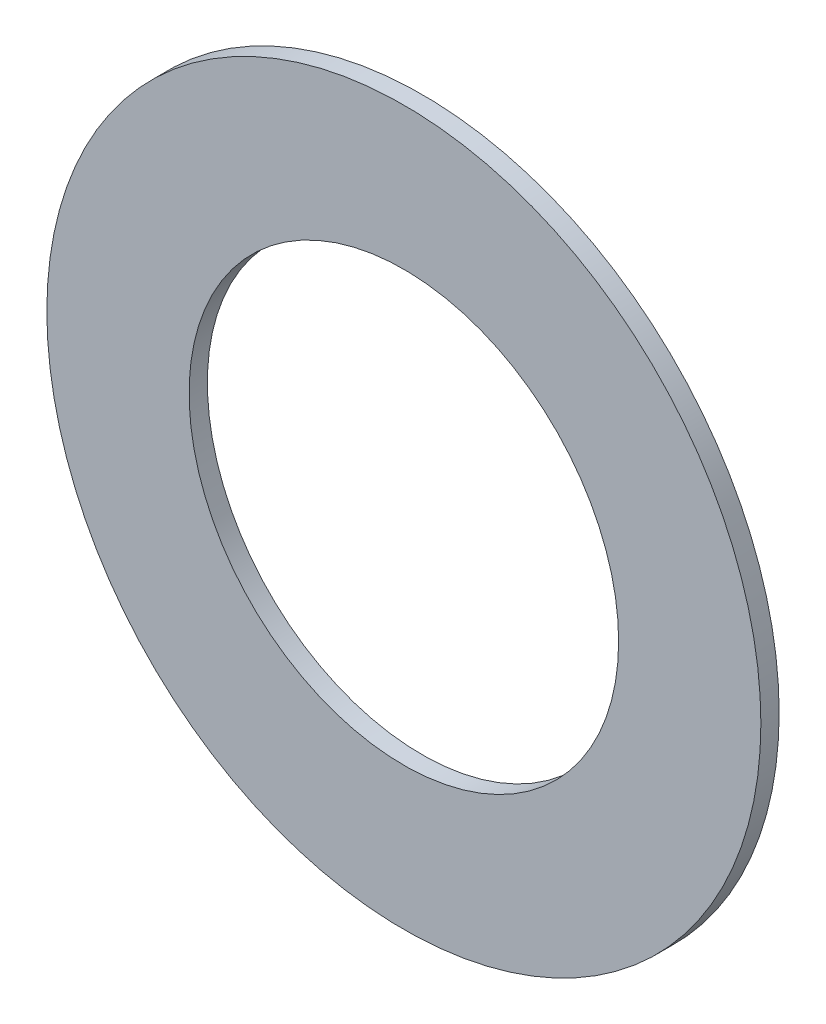
ISO-10303-21;
HEADER;
FILE_DESCRIPTION(('STEP AP214'),'2;1');
FILE_NAME('part.step','',(''),(''),'','','');
FILE_SCHEMA(('AUTOMOTIVE_DESIGN { 1 0 10303 214 1 1 1 1 }'));
ENDSEC;
DATA;
#1=APPLICATION_CONTEXT('core data for automotive mechanical design processes');
#2=APPLICATION_PROTOCOL_DEFINITION('international standard','automotive_design',2000,#1);
#3=PRODUCT_CONTEXT('',#1,'mechanical');
#4=PRODUCT('Part','Part','',(#3));
#5=PRODUCT_RELATED_PRODUCT_CATEGORY('part','',(#4));
#6=PRODUCT_DEFINITION_FORMATION('','',#4);
#7=PRODUCT_DEFINITION_CONTEXT('part definition',#1,'design');
#8=PRODUCT_DEFINITION('design','',#6,#7);
#9=PRODUCT_DEFINITION_SHAPE('','',#8);
#10=(LENGTH_UNIT() NAMED_UNIT(*) SI_UNIT(.MILLI.,.METRE.));
#11=(NAMED_UNIT(*) PLANE_ANGLE_UNIT() SI_UNIT($,.RADIAN.));
#12=(NAMED_UNIT(*) SI_UNIT($,.STERADIAN.) SOLID_ANGLE_UNIT());
#13=UNCERTAINTY_MEASURE_WITH_UNIT(LENGTH_MEASURE(1.E-05),#10,'distance_accuracy_value','');
#14=(GEOMETRIC_REPRESENTATION_CONTEXT(3) GLOBAL_UNCERTAINTY_ASSIGNED_CONTEXT((#13)) GLOBAL_UNIT_ASSIGNED_CONTEXT((#10,
#11,#12)) REPRESENTATION_CONTEXT('',''));
#15=CARTESIAN_POINT('',(0.,0.,0.));
#16=DIRECTION('',(0.,0.,1.));
#17=DIRECTION('',(1.,0.,0.));
#18=AXIS2_PLACEMENT_3D('',#15,#16,#17);
#19=CARTESIAN_POINT('',(0.,0.,-0.406399999999998));
#20=DIRECTION('',(0.,0.,1.));
#21=DIRECTION('',(1.,0.,0.));
#22=AXIS2_PLACEMENT_3D('',#19,#20,#21);
#23=CYLINDRICAL_SURFACE('',#22,15.875);
#24=CARTESIAN_POINT('',(0.,0.,-0.406399999999998));
#25=DIRECTION('',(0.,0.,1.));
#26=DIRECTION('',(1.,0.,0.));
#27=AXIS2_PLACEMENT_3D('',#24,#25,#26);
#28=CIRCLE('',#27,15.875);
#29=CARTESIAN_POINT('',(15.875,0.,-0.406399999999998));
#30=VERTEX_POINT('',#29);
#31=EDGE_CURVE('E10',#30,#30,#28,.T.);
#32=ORIENTED_EDGE('',*,*,#31,.T.);
#33=EDGE_LOOP('',(#32));
#34=FACE_BOUND('',#33,.T.);
#35=CARTESIAN_POINT('',(0.,0.,0.406400000000002));
#36=DIRECTION('',(0.,0.,1.));
#37=DIRECTION('',(1.,0.,0.));
#38=AXIS2_PLACEMENT_3D('',#35,#36,#37);
#39=CIRCLE('',#38,15.875);
#40=CARTESIAN_POINT('',(15.875,0.,0.406400000000002));
#41=VERTEX_POINT('',#40);
#42=EDGE_CURVE('E51',#41,#41,#39,.T.);
#43=ORIENTED_EDGE('',*,*,#42,.F.);
#44=EDGE_LOOP('',(#43));
#45=FACE_BOUND('',#44,.T.);
#46=ADVANCED_FACE('F39',(#34,#45),#23,.T.);
#47=CARTESIAN_POINT('',(0.,0.,-0.406399999999998));
#48=DIRECTION('',(0.,0.,1.));
#49=DIRECTION('',(1.,0.,0.));
#50=AXIS2_PLACEMENT_3D('',#47,#48,#49);
#51=PLANE('',#50);
#52=CARTESIAN_POINT('',(0.,0.,-0.406399999999998));
#53=DIRECTION('',(0.,0.,1.));
#54=DIRECTION('',(1.,0.,0.));
#55=AXIS2_PLACEMENT_3D('',#52,#53,#54);
#56=CIRCLE('',#55,9.5504);
#57=CARTESIAN_POINT('',(9.5504,0.,-0.406399999999998));
#58=VERTEX_POINT('',#57);
#59=EDGE_CURVE('E46',#58,#58,#56,.T.);
#60=ORIENTED_EDGE('',*,*,#59,.T.);
#61=EDGE_LOOP('',(#60));
#62=FACE_BOUND('',#61,.T.);
#63=ORIENTED_EDGE('',*,*,#31,.F.);
#64=EDGE_LOOP('',(#63));
#65=FACE_BOUND('',#64,.T.);
#66=ADVANCED_FACE('F72',(#62,#65),#51,.F.);
#67=CARTESIAN_POINT('',(0.,0.,-0.406399999999998));
#68=DIRECTION('',(0.,0.,1.));
#69=DIRECTION('',(1.,0.,0.));
#70=AXIS2_PLACEMENT_3D('',#67,#68,#69);
#71=CYLINDRICAL_SURFACE('',#70,9.5504);
#72=ORIENTED_EDGE('',*,*,#59,.F.);
#73=EDGE_LOOP('',(#72));
#74=FACE_BOUND('',#73,.T.);
#75=CARTESIAN_POINT('',(0.,0.,0.406400000000002));
#76=DIRECTION('',(0.,0.,1.));
#77=DIRECTION('',(1.,0.,0.));
#78=AXIS2_PLACEMENT_3D('',#75,#76,#77);
#79=CIRCLE('',#78,9.5504);
#80=CARTESIAN_POINT('',(9.5504,0.,0.406400000000002));
#81=VERTEX_POINT('',#80);
#82=EDGE_CURVE('E56',#81,#81,#79,.T.);
#83=ORIENTED_EDGE('',*,*,#82,.T.);
#84=EDGE_LOOP('',(#83));
#85=FACE_BOUND('',#84,.T.);
#86=ADVANCED_FACE('F63',(#74,#85),#71,.F.);
#87=CARTESIAN_POINT('',(0.,0.,0.406400000000002));
#88=DIRECTION('',(0.,0.,1.));
#89=DIRECTION('',(1.,0.,0.));
#90=AXIS2_PLACEMENT_3D('',#87,#88,#89);
#91=PLANE('',#90);
#92=ORIENTED_EDGE('',*,*,#42,.T.);
#93=EDGE_LOOP('',(#92));
#94=FACE_BOUND('',#93,.T.);
#95=ORIENTED_EDGE('',*,*,#82,.F.);
#96=EDGE_LOOP('',(#95));
#97=FACE_BOUND('',#96,.T.);
#98=ADVANCED_FACE('F65',(#94,#97),#91,.T.);
#99=CLOSED_SHELL('',(#46,#66,#86,#98));
#100=MANIFOLD_SOLID_BREP('B2',#99);
#101=ADVANCED_BREP_SHAPE_REPRESENTATION('',(#18,#100),#14);
#102=SHAPE_DEFINITION_REPRESENTATION(#9,#101);
ENDSEC;
END-ISO-10303-21;
